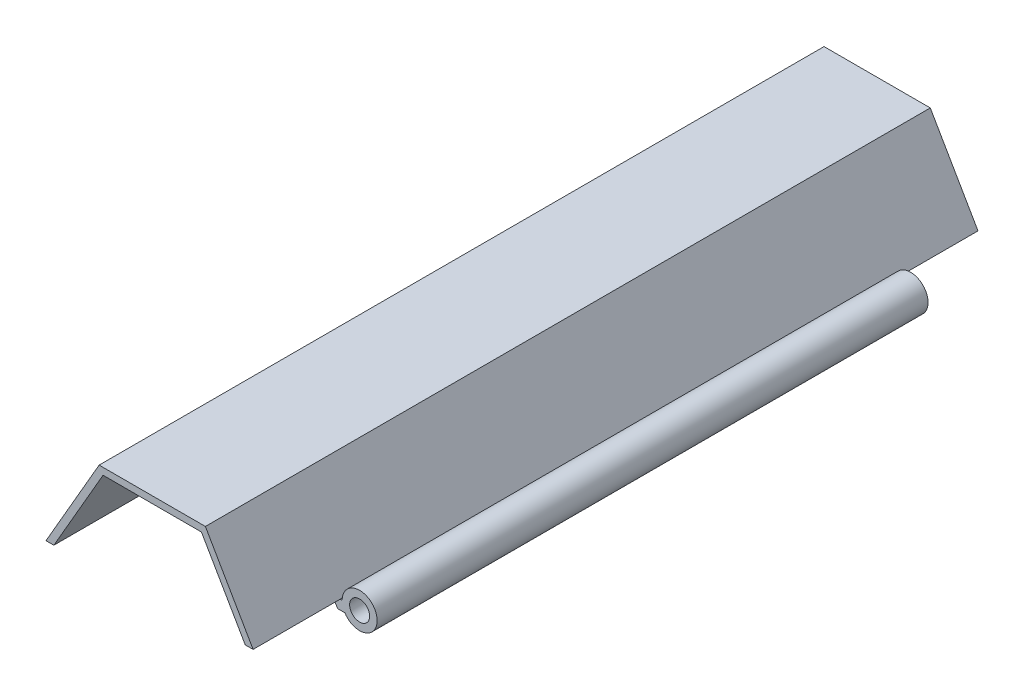
ISO-10303-21;
HEADER;
FILE_DESCRIPTION(('STEP AP214'),'2;1');
FILE_NAME('part.step','',(''),(''),'','','');
FILE_SCHEMA(('AUTOMOTIVE_DESIGN { 1 0 10303 214 1 1 1 1 }'));
ENDSEC;
DATA;
#1=APPLICATION_CONTEXT('core data for automotive mechanical design processes');
#2=APPLICATION_PROTOCOL_DEFINITION('international standard','automotive_design',2000,#1);
#3=PRODUCT_CONTEXT('',#1,'mechanical');
#4=PRODUCT('Part','Part','',(#3));
#5=PRODUCT_RELATED_PRODUCT_CATEGORY('part','',(#4));
#6=PRODUCT_DEFINITION_FORMATION('','',#4);
#7=PRODUCT_DEFINITION_CONTEXT('part definition',#1,'design');
#8=PRODUCT_DEFINITION('design','',#6,#7);
#9=PRODUCT_DEFINITION_SHAPE('','',#8);
#10=(LENGTH_UNIT() NAMED_UNIT(*) SI_UNIT(.MILLI.,.METRE.));
#11=(NAMED_UNIT(*) PLANE_ANGLE_UNIT() SI_UNIT($,.RADIAN.));
#12=(NAMED_UNIT(*) SI_UNIT($,.STERADIAN.) SOLID_ANGLE_UNIT());
#13=UNCERTAINTY_MEASURE_WITH_UNIT(LENGTH_MEASURE(1.E-05),#10,'distance_accuracy_value','');
#14=(GEOMETRIC_REPRESENTATION_CONTEXT(3) GLOBAL_UNCERTAINTY_ASSIGNED_CONTEXT((#13)) GLOBAL_UNIT_ASSIGNED_CONTEXT((#10,
#11,#12)) REPRESENTATION_CONTEXT('',''));
#15=CARTESIAN_POINT('',(0.,0.,0.));
#16=DIRECTION('',(0.,0.,1.));
#17=DIRECTION('',(1.,0.,0.));
#18=AXIS2_PLACEMENT_3D('',#15,#16,#17);
#19=CARTESIAN_POINT('',(0.,-1.95156391047385E-12,184.2));
#20=DIRECTION('',(0.,1.,0.));
#21=DIRECTION('',(-1.,0.,0.));
#22=AXIS2_PLACEMENT_3D('',#19,#20,#21);
#23=PLANE('',#22);
#24=DIRECTION('',(-1.,0.,0.));
#25=VECTOR('',#24,1.);
#26=CARTESIAN_POINT('',(25.,0.,22.098));
#27=LINE('',#26,#25);
#28=CARTESIAN_POINT('',(26.8417586531243,1.17961196366423E-13,22.098));
#29=VERTEX_POINT('',#28);
#30=CARTESIAN_POINT('',(25.,0.,22.098));
#31=VERTEX_POINT('',#30);
#32=EDGE_CURVE('E201',#29,#31,#27,.T.);
#33=ORIENTED_EDGE('',*,*,#32,.F.);
#34=DIRECTION('',(0.,0.,-1.));
#35=VECTOR('',#34,1.);
#36=CARTESIAN_POINT('',(26.8417586531243,1.43772388769611E-13,184.2));
#37=LINE('',#36,#35);
#38=CARTESIAN_POINT('',(26.8417586531243,1.55257751099924E-13,162.102));
#39=VERTEX_POINT('',#38);
#40=EDGE_CURVE('E48',#39,#29,#37,.T.);
#41=ORIENTED_EDGE('',*,*,#40,.F.);
#42=DIRECTION('',(1.,0.,0.));
#43=VECTOR('',#42,1.);
#44=CARTESIAN_POINT('',(25.,0.,162.102));
#45=LINE('',#44,#43);
#46=CARTESIAN_POINT('',(25.,0.,162.102));
#47=VERTEX_POINT('',#46);
#48=EDGE_CURVE('E198',#47,#39,#45,.T.);
#49=ORIENTED_EDGE('',*,*,#48,.F.);
#50=DIRECTION('',(0.,0.,-1.));
#51=VECTOR('',#50,1.);
#52=CARTESIAN_POINT('',(25.,0.,184.2));
#53=LINE('',#52,#51);
#54=EDGE_CURVE('E146',#47,#31,#53,.T.);
#55=ORIENTED_EDGE('',*,*,#54,.T.);
#56=EDGE_LOOP('',(#33,#41,#49,#55));
#57=FACE_BOUND('',#56,.T.);
#58=ADVANCED_FACE('F40',(#57),#23,.F.);
#59=CARTESIAN_POINT('',(30.5959063593286,2.38000000000014,184.2));
#60=DIRECTION('',(0.,0.,-1.));
#61=DIRECTION('',(-1.,0.,0.));
#62=AXIS2_PLACEMENT_3D('',#59,#60,#61);
#63=CYLINDRICAL_SURFACE('',#62,4.44500000000001);
#64=CARTESIAN_POINT('',(30.5959063593286,2.38000000000014,22.098));
#65=DIRECTION('',(0.,0.,-1.));
#66=DIRECTION('',(-1.,0.,0.));
#67=AXIS2_PLACEMENT_3D('',#64,#65,#66);
#68=CIRCLE('',#67,4.44499999999997);
#69=CARTESIAN_POINT('',(26.1509063593286,2.38000000000009,22.098));
#70=VERTEX_POINT('',#69);
#71=EDGE_CURVE('E187',#70,#29,#68,.T.);
#72=ORIENTED_EDGE('',*,*,#71,.F.);
#73=DIRECTION('',(0.,0.,-1.));
#74=VECTOR('',#73,1.);
#75=CARTESIAN_POINT('',(26.1509063593286,2.38000000000009,184.2));
#76=LINE('',#75,#74);
#77=CARTESIAN_POINT('',(26.1509063593287,2.38000000000016,162.102));
#78=VERTEX_POINT('',#77);
#79=EDGE_CURVE('E175',#78,#70,#76,.T.);
#80=ORIENTED_EDGE('',*,*,#79,.F.);
#81=CARTESIAN_POINT('',(30.5959063593286,2.38000000000014,162.102));
#82=DIRECTION('',(0.,0.,1.));
#83=DIRECTION('',(1.,0.,0.));
#84=AXIS2_PLACEMENT_3D('',#81,#82,#83);
#85=CIRCLE('',#84,4.44499999999991);
#86=EDGE_CURVE('E190',#39,#78,#85,.T.);
#87=ORIENTED_EDGE('',*,*,#86,.F.);
#88=ORIENTED_EDGE('',*,*,#40,.T.);
#89=EDGE_LOOP('',(#72,#80,#87,#88));
#90=FACE_BOUND('',#89,.T.);
#91=ADVANCED_FACE('F183',(#90),#63,.T.);
#92=CARTESIAN_POINT('',(2.92936970977087E-13,2.38000000000331,184.2));
#93=DIRECTION('',(1.23082760914571E-13,1.,0.));
#94=DIRECTION('',(-1.,1.23082760914571E-13,0.));
#95=AXIS2_PLACEMENT_3D('',#92,#93,#94);
#96=PLANE('',#95);
#97=ORIENTED_EDGE('',*,*,#79,.T.);
#98=DIRECTION('',(1.,0.,0.));
#99=VECTOR('',#98,1.);
#100=CARTESIAN_POINT('',(23.6259063593286,2.38000000000016,22.098));
#101=LINE('',#100,#99);
#102=CARTESIAN_POINT('',(25.6259063593288,2.3800000000001,22.098));
#103=VERTEX_POINT('',#102);
#104=EDGE_CURVE('E231',#103,#70,#101,.T.);
#105=ORIENTED_EDGE('',*,*,#104,.F.);
#106=DIRECTION('',(0.,0.,-1.));
#107=VECTOR('',#106,1.);
#108=CARTESIAN_POINT('',(25.6259063593287,2.38000000000016,184.2));
#109=LINE('',#108,#107);
#110=CARTESIAN_POINT('',(25.6259063593287,2.38000000000015,162.102));
#111=VERTEX_POINT('',#110);
#112=EDGE_CURVE('E173',#111,#103,#109,.T.);
#113=ORIENTED_EDGE('',*,*,#112,.F.);
#114=DIRECTION('',(-1.,0.,0.));
#115=VECTOR('',#114,1.);
#116=CARTESIAN_POINT('',(23.6259063593286,2.38000000000013,162.102));
#117=LINE('',#116,#115);
#118=EDGE_CURVE('E252',#78,#111,#117,.T.);
#119=ORIENTED_EDGE('',*,*,#118,.F.);
#120=EDGE_LOOP('',(#97,#105,#113,#119));
#121=FACE_BOUND('',#120,.T.);
#122=ADVANCED_FACE('F282',(#121),#96,.T.);
#123=CARTESIAN_POINT('',(30.5959063593286,2.38000000000014,184.2));
#124=DIRECTION('',(0.,0.,-1.));
#125=DIRECTION('',(-1.,0.,0.));
#126=AXIS2_PLACEMENT_3D('',#123,#124,#125);
#127=CYLINDRICAL_SURFACE('',#126,2.54);
#128=CARTESIAN_POINT('',(30.5959063593286,2.38000000000014,162.102));
#129=DIRECTION('',(0.,0.,1.));
#130=DIRECTION('',(1.,0.,0.));
#131=AXIS2_PLACEMENT_3D('',#128,#129,#130);
#132=CIRCLE('',#131,2.54);
#133=CARTESIAN_POINT('',(33.1359063593286,2.38000000000014,162.102));
#134=VERTEX_POINT('',#133);
#135=EDGE_CURVE('E150',#134,#134,#132,.T.);
#136=ORIENTED_EDGE('',*,*,#135,.T.);
#137=EDGE_LOOP('',(#136));
#138=FACE_BOUND('',#137,.T.);
#139=CARTESIAN_POINT('',(30.5959063593286,2.38000000000014,22.098));
#140=DIRECTION('',(0.,0.,-1.));
#141=DIRECTION('',(-1.,0.,0.));
#142=AXIS2_PLACEMENT_3D('',#139,#140,#141);
#143=CIRCLE('',#142,2.54);
#144=CARTESIAN_POINT('',(28.0559063593286,2.38000000000014,22.098));
#145=VERTEX_POINT('',#144);
#146=EDGE_CURVE('E240',#145,#145,#143,.T.);
#147=ORIENTED_EDGE('',*,*,#146,.T.);
#148=EDGE_LOOP('',(#147));
#149=FACE_BOUND('',#148,.T.);
#150=ADVANCED_FACE('F42',(#138,#149),#127,.F.);
#151=CARTESIAN_POINT('',(20.25,11.69134295109,184.2));
#152=DIRECTION('',(-0.866025403784436,-0.500000000000004,0.));
#153=DIRECTION('',(0.500000000000004,-0.866025403784436,0.));
#154=AXIS2_PLACEMENT_3D('',#151,#152,#153);
#155=PLANE('',#154);
#156=DIRECTION('',(-0.500000000000004,0.866025403784436,0.));
#157=VECTOR('',#156,1.);
#158=CARTESIAN_POINT('',(20.25,11.69134295109,0.));
#159=LINE('',#158,#157);
#160=CARTESIAN_POINT('',(25.6259063593288,2.3800000000001,0.));
#161=VERTEX_POINT('',#160);
#162=CARTESIAN_POINT('',(13.4999999999999,23.38268590218,0.));
#163=VERTEX_POINT('',#162);
#164=EDGE_CURVE('E147',#161,#163,#159,.T.);
#165=ORIENTED_EDGE('',*,*,#164,.T.);
#166=DIRECTION('',(0.,0.,-1.));
#167=VECTOR('',#166,1.);
#168=CARTESIAN_POINT('',(13.4999999999999,23.38268590218,184.2));
#169=LINE('',#168,#167);
#170=CARTESIAN_POINT('',(13.4999999999999,23.38268590218,184.2));
#171=VERTEX_POINT('',#170);
#172=EDGE_CURVE('E170',#171,#163,#169,.T.);
#173=ORIENTED_EDGE('',*,*,#172,.F.);
#174=DIRECTION('',(-0.500000000000004,0.866025403784436,0.));
#175=VECTOR('',#174,1.);
#176=CARTESIAN_POINT('',(20.25,11.69134295109,184.2));
#177=LINE('',#176,#175);
#178=CARTESIAN_POINT('',(25.6259063593287,2.38000000000016,184.2));
#179=VERTEX_POINT('',#178);
#180=EDGE_CURVE('E160',#179,#171,#177,.T.);
#181=ORIENTED_EDGE('',*,*,#180,.F.);
#182=EDGE_CURVE('E99',#179,#111,#109,.T.);
#183=ORIENTED_EDGE('',*,*,#182,.T.);
#184=ORIENTED_EDGE('',*,*,#112,.T.);
#185=DIRECTION('',(0.,0.,-1.));
#186=VECTOR('',#185,1.);
#187=CARTESIAN_POINT('',(25.6259063593288,2.3800000000001,184.2));
#188=LINE('',#187,#186);
#189=EDGE_CURVE('E218',#103,#161,#188,.T.);
#190=ORIENTED_EDGE('',*,*,#189,.T.);
#191=EDGE_LOOP('',(#165,#173,#181,#183,#184,#190));
#192=FACE_BOUND('',#191,.T.);
#193=ADVANCED_FACE('F277',(#192),#155,.F.);
#194=CARTESIAN_POINT('',(-1.08166651109076E-13,23.3826859021799,184.2));
#195=DIRECTION('',(0.,-1.,0.));
#196=DIRECTION('',(1.,0.,0.));
#197=AXIS2_PLACEMENT_3D('',#194,#195,#196);
#198=PLANE('',#197);
#199=DIRECTION('',(-1.,0.,0.));
#200=VECTOR('',#199,1.);
#201=CARTESIAN_POINT('',(-1.08166651109076E-13,23.3826859021799,0.));
#202=LINE('',#201,#200);
#203=CARTESIAN_POINT('',(-13.5000000000002,23.3826859021799,0.));
#204=VERTEX_POINT('',#203);
#205=EDGE_CURVE('E149',#163,#204,#202,.T.);
#206=ORIENTED_EDGE('',*,*,#205,.T.);
#207=DIRECTION('',(0.,0.,-1.));
#208=VECTOR('',#207,1.);
#209=CARTESIAN_POINT('',(-13.5000000000002,23.3826859021799,184.2));
#210=LINE('',#209,#208);
#211=CARTESIAN_POINT('',(-13.5000000000002,23.3826859021799,184.2));
#212=VERTEX_POINT('',#211);
#213=EDGE_CURVE('E167',#212,#204,#210,.T.);
#214=ORIENTED_EDGE('',*,*,#213,.F.);
#215=DIRECTION('',(-1.,0.,0.));
#216=VECTOR('',#215,1.);
#217=CARTESIAN_POINT('',(-1.08166651109076E-13,23.3826859021799,184.2));
#218=LINE('',#217,#216);
#219=EDGE_CURVE('E260',#171,#212,#218,.T.);
#220=ORIENTED_EDGE('',*,*,#219,.F.);
#221=ORIENTED_EDGE('',*,*,#172,.T.);
#222=EDGE_LOOP('',(#206,#214,#220,#221));
#223=FACE_BOUND('',#222,.T.);
#224=ADVANCED_FACE('F266',(#223),#198,.F.);
#225=CARTESIAN_POINT('',(-20.2500000000001,11.6913429510898,184.2));
#226=DIRECTION('',(0.866025403784442,-0.499999999999993,0.));
#227=DIRECTION('',(0.499999999999993,0.866025403784443,0.));
#228=AXIS2_PLACEMENT_3D('',#225,#226,#227);
#229=PLANE('',#228);
#230=DIRECTION('',(-0.499999999999993,-0.866025403784443,0.));
#231=VECTOR('',#230,1.);
#232=CARTESIAN_POINT('',(-20.2500000000001,11.6913429510898,0.));
#233=LINE('',#232,#231);
#234=CARTESIAN_POINT('',(-27.,-1.4997829630167E-13,0.));
#235=VERTEX_POINT('',#234);
#236=EDGE_CURVE('E152',#204,#235,#233,.T.);
#237=ORIENTED_EDGE('',*,*,#236,.T.);
#238=DIRECTION('',(0.,0.,-1.));
#239=VECTOR('',#238,1.);
#240=CARTESIAN_POINT('',(-27.,-1.4997829630167E-13,184.2));
#241=LINE('',#240,#239);
#242=CARTESIAN_POINT('',(-27.,-1.4997829630167E-13,184.2));
#243=VERTEX_POINT('',#242);
#244=EDGE_CURVE('E136',#243,#235,#241,.T.);
#245=ORIENTED_EDGE('',*,*,#244,.F.);
#246=DIRECTION('',(-0.499999999999993,-0.866025403784443,0.));
#247=VECTOR('',#246,1.);
#248=CARTESIAN_POINT('',(-20.2500000000001,11.6913429510898,184.2));
#249=LINE('',#248,#247);
#250=EDGE_CURVE('E123',#212,#243,#249,.T.);
#251=ORIENTED_EDGE('',*,*,#250,.F.);
#252=ORIENTED_EDGE('',*,*,#213,.T.);
#253=EDGE_LOOP('',(#237,#245,#251,#252));
#254=FACE_BOUND('',#253,.T.);
#255=ADVANCED_FACE('F270',(#254),#229,.F.);
#256=CARTESIAN_POINT('',(0.,-4.82021199948234E-13,184.2));
#257=DIRECTION('',(0.,1.,0.));
#258=DIRECTION('',(-1.,0.,0.));
#259=AXIS2_PLACEMENT_3D('',#256,#257,#258);
#260=PLANE('',#259);
#261=DIRECTION('',(1.,0.,0.));
#262=VECTOR('',#261,1.);
#263=CARTESIAN_POINT('',(0.,-4.82021199948234E-13,0.));
#264=LINE('',#263,#262);
#265=CARTESIAN_POINT('',(-25.,-1.74574066942157E-13,0.));
#266=VERTEX_POINT('',#265);
#267=EDGE_CURVE('E132',#235,#266,#264,.T.);
#268=ORIENTED_EDGE('',*,*,#267,.T.);
#269=DIRECTION('',(0.,0.,-1.));
#270=VECTOR('',#269,1.);
#271=CARTESIAN_POINT('',(-25.,-1.74574066942157E-13,184.2));
#272=LINE('',#271,#270);
#273=CARTESIAN_POINT('',(-25.,-1.74574066942157E-13,184.2));
#274=VERTEX_POINT('',#273);
#275=EDGE_CURVE('E129',#274,#266,#272,.T.);
#276=ORIENTED_EDGE('',*,*,#275,.F.);
#277=DIRECTION('',(1.,0.,0.));
#278=VECTOR('',#277,1.);
#279=CARTESIAN_POINT('',(0.,-4.82021199948234E-13,184.2));
#280=LINE('',#279,#278);
#281=EDGE_CURVE('E115',#243,#274,#280,.T.);
#282=ORIENTED_EDGE('',*,*,#281,.F.);
#283=ORIENTED_EDGE('',*,*,#244,.T.);
#284=EDGE_LOOP('',(#268,#276,#282,#283));
#285=FACE_BOUND('',#284,.T.);
#286=ADVANCED_FACE('F130',(#285),#260,.F.);
#287=CARTESIAN_POINT('',(-18.75,10.8253175473054,184.2));
#288=DIRECTION('',(0.866025403784442,-0.499999999999995,0.));
#289=DIRECTION('',(0.499999999999995,0.866025403784442,0.));
#290=AXIS2_PLACEMENT_3D('',#287,#288,#289);
#291=PLANE('',#290);
#292=DIRECTION('',(-0.499999999999995,-0.866025403784442,0.));
#293=VECTOR('',#292,1.);
#294=CARTESIAN_POINT('',(-18.75,10.8253175473054,0.));
#295=LINE('',#294,#293);
#296=CARTESIAN_POINT('',(-12.5000000000001,21.6506350946109,0.));
#297=VERTEX_POINT('',#296);
#298=EDGE_CURVE('E155',#297,#266,#295,.T.);
#299=ORIENTED_EDGE('',*,*,#298,.F.);
#300=DIRECTION('',(0.,0.,-1.));
#301=VECTOR('',#300,1.);
#302=CARTESIAN_POINT('',(-12.5000000000001,21.6506350946109,184.2));
#303=LINE('',#302,#301);
#304=CARTESIAN_POINT('',(-12.5000000000001,21.6506350946109,184.2));
#305=VERTEX_POINT('',#304);
#306=EDGE_CURVE('E137',#305,#297,#303,.T.);
#307=ORIENTED_EDGE('',*,*,#306,.F.);
#308=DIRECTION('',(-0.499999999999995,-0.866025403784442,0.));
#309=VECTOR('',#308,1.);
#310=CARTESIAN_POINT('',(-18.75,10.8253175473054,184.2));
#311=LINE('',#310,#309);
#312=EDGE_CURVE('E120',#305,#274,#311,.T.);
#313=ORIENTED_EDGE('',*,*,#312,.T.);
#314=ORIENTED_EDGE('',*,*,#275,.T.);
#315=EDGE_LOOP('',(#299,#307,#313,#314));
#316=FACE_BOUND('',#315,.T.);
#317=ADVANCED_FACE('F139',(#316),#291,.T.);
#318=CARTESIAN_POINT('',(0.,21.650635094611,184.2));
#319=DIRECTION('',(0.,-1.,0.));
#320=DIRECTION('',(1.,0.,0.));
#321=AXIS2_PLACEMENT_3D('',#318,#319,#320);
#322=PLANE('',#321);
#323=DIRECTION('',(-1.,0.,0.));
#324=VECTOR('',#323,1.);
#325=CARTESIAN_POINT('',(0.,21.650635094611,0.));
#326=LINE('',#325,#324);
#327=CARTESIAN_POINT('',(12.4999999999999,21.650635094611,0.));
#328=VERTEX_POINT('',#327);
#329=EDGE_CURVE('E157',#328,#297,#326,.T.);
#330=ORIENTED_EDGE('',*,*,#329,.F.);
#331=DIRECTION('',(0.,0.,-1.));
#332=VECTOR('',#331,1.);
#333=CARTESIAN_POINT('',(12.4999999999999,21.650635094611,184.2));
#334=LINE('',#333,#332);
#335=CARTESIAN_POINT('',(12.4999999999999,21.650635094611,184.2));
#336=VERTEX_POINT('',#335);
#337=EDGE_CURVE('E163',#336,#328,#334,.T.);
#338=ORIENTED_EDGE('',*,*,#337,.F.);
#339=DIRECTION('',(-1.,0.,0.));
#340=VECTOR('',#339,1.);
#341=CARTESIAN_POINT('',(0.,21.650635094611,184.2));
#342=LINE('',#341,#340);
#343=EDGE_CURVE('E140',#336,#305,#342,.T.);
#344=ORIENTED_EDGE('',*,*,#343,.T.);
#345=ORIENTED_EDGE('',*,*,#306,.T.);
#346=EDGE_LOOP('',(#330,#338,#344,#345));
#347=FACE_BOUND('',#346,.T.);
#348=ADVANCED_FACE('F275',(#347),#322,.T.);
#349=CARTESIAN_POINT('',(18.75,10.8253175473055,184.2));
#350=DIRECTION('',(-0.866025403784438,-0.500000000000001,0.));
#351=DIRECTION('',(0.500000000000001,-0.866025403784438,0.));
#352=AXIS2_PLACEMENT_3D('',#349,#350,#351);
#353=PLANE('',#352);
#354=DIRECTION('',(0.,0.,-1.));
#355=VECTOR('',#354,1.);
#356=CARTESIAN_POINT('',(23.6259063593286,2.38000000000016,22.098));
#357=LINE('',#356,#355);
#358=CARTESIAN_POINT('',(23.6259063593286,2.38000000000016,22.098));
#359=VERTEX_POINT('',#358);
#360=CARTESIAN_POINT('',(23.6259063593286,2.38000000000016,0.));
#361=VERTEX_POINT('',#360);
#362=EDGE_CURVE('E55',#359,#361,#357,.T.);
#363=ORIENTED_EDGE('',*,*,#362,.F.);
#364=DIRECTION('',(-0.500000000000001,0.866025403784438,0.));
#365=VECTOR('',#364,1.);
#366=CARTESIAN_POINT('',(23.6259063593286,2.38000000000016,22.098));
#367=LINE('',#366,#365);
#368=EDGE_CURVE('E234',#31,#359,#367,.T.);
#369=ORIENTED_EDGE('',*,*,#368,.F.);
#370=ORIENTED_EDGE('',*,*,#54,.F.);
#371=DIRECTION('',(0.500000000000001,-0.866025403784438,0.));
#372=VECTOR('',#371,1.);
#373=CARTESIAN_POINT('',(23.6259063593286,2.38000000000013,162.102));
#374=LINE('',#373,#372);
#375=CARTESIAN_POINT('',(23.6259063593286,2.38000000000013,162.102));
#376=VERTEX_POINT('',#375);
#377=EDGE_CURVE('E247',#376,#47,#374,.T.);
#378=ORIENTED_EDGE('',*,*,#377,.F.);
#379=DIRECTION('',(0.,0.,1.));
#380=VECTOR('',#379,1.);
#381=CARTESIAN_POINT('',(23.6259063593286,2.38000000000013,162.102));
#382=LINE('',#381,#380);
#383=CARTESIAN_POINT('',(23.6259063593286,2.38000000000013,184.2));
#384=VERTEX_POINT('',#383);
#385=EDGE_CURVE('E255',#376,#384,#382,.T.);
#386=ORIENTED_EDGE('',*,*,#385,.T.);
#387=DIRECTION('',(-0.500000000000001,0.866025403784438,0.));
#388=VECTOR('',#387,1.);
#389=CARTESIAN_POINT('',(18.75,10.8253175473055,184.2));
#390=LINE('',#389,#388);
#391=EDGE_CURVE('E64',#384,#336,#390,.T.);
#392=ORIENTED_EDGE('',*,*,#391,.T.);
#393=ORIENTED_EDGE('',*,*,#337,.T.);
#394=DIRECTION('',(-0.500000000000001,0.866025403784438,0.));
#395=VECTOR('',#394,1.);
#396=CARTESIAN_POINT('',(18.75,10.8253175473055,0.));
#397=LINE('',#396,#395);
#398=EDGE_CURVE('E92',#361,#328,#397,.T.);
#399=ORIENTED_EDGE('',*,*,#398,.F.);
#400=EDGE_LOOP('',(#363,#369,#370,#378,#386,#392,#393,#399));
#401=FACE_BOUND('',#400,.T.);
#402=ADVANCED_FACE('F238',(#401),#353,.T.);
#403=CARTESIAN_POINT('',(0.,0.,184.2));
#404=DIRECTION('',(0.,0.,1.));
#405=DIRECTION('',(1.,0.,0.));
#406=AXIS2_PLACEMENT_3D('',#403,#404,#405);
#407=PLANE('',#406);
#408=DIRECTION('',(-1.,0.,0.));
#409=VECTOR('',#408,1.);
#410=CARTESIAN_POINT('',(0.,2.37999999999986,184.2));
#411=LINE('',#410,#409);
#412=EDGE_CURVE('E11',#179,#384,#411,.T.);
#413=ORIENTED_EDGE('',*,*,#412,.F.);
#414=ORIENTED_EDGE('',*,*,#180,.T.);
#415=ORIENTED_EDGE('',*,*,#219,.T.);
#416=ORIENTED_EDGE('',*,*,#250,.T.);
#417=ORIENTED_EDGE('',*,*,#281,.T.);
#418=ORIENTED_EDGE('',*,*,#312,.F.);
#419=ORIENTED_EDGE('',*,*,#343,.F.);
#420=ORIENTED_EDGE('',*,*,#391,.F.);
#421=EDGE_LOOP('',(#413,#414,#415,#416,#417,#418,#419,#420));
#422=FACE_BOUND('',#421,.T.);
#423=ADVANCED_FACE('F117',(#422),#407,.T.);
#424=CARTESIAN_POINT('',(0.,0.,0.));
#425=DIRECTION('',(0.,0.,1.));
#426=DIRECTION('',(1.,0.,0.));
#427=AXIS2_PLACEMENT_3D('',#424,#425,#426);
#428=PLANE('',#427);
#429=ORIENTED_EDGE('',*,*,#164,.F.);
#430=DIRECTION('',(1.,0.,0.));
#431=VECTOR('',#430,1.);
#432=CARTESIAN_POINT('',(23.6259063593286,2.38000000000016,0.));
#433=LINE('',#432,#431);
#434=EDGE_CURVE('E236',#361,#161,#433,.T.);
#435=ORIENTED_EDGE('',*,*,#434,.F.);
#436=ORIENTED_EDGE('',*,*,#398,.T.);
#437=ORIENTED_EDGE('',*,*,#329,.T.);
#438=ORIENTED_EDGE('',*,*,#298,.T.);
#439=ORIENTED_EDGE('',*,*,#267,.F.);
#440=ORIENTED_EDGE('',*,*,#236,.F.);
#441=ORIENTED_EDGE('',*,*,#205,.F.);
#442=EDGE_LOOP('',(#429,#435,#436,#437,#438,#439,#440,#441));
#443=FACE_BOUND('',#442,.T.);
#444=ADVANCED_FACE('F272',(#443),#428,.F.);
#445=CARTESIAN_POINT('',(23.6259063593286,2.38000000000013,162.102));
#446=DIRECTION('',(0.,1.,0.));
#447=DIRECTION('',(-1.,0.,0.));
#448=AXIS2_PLACEMENT_3D('',#445,#446,#447);
#449=PLANE('',#448);
#450=ORIENTED_EDGE('',*,*,#412,.T.);
#451=ORIENTED_EDGE('',*,*,#385,.F.);
#452=EDGE_CURVE('E251',#111,#376,#117,.T.);
#453=ORIENTED_EDGE('',*,*,#452,.F.);
#454=ORIENTED_EDGE('',*,*,#182,.F.);
#455=EDGE_LOOP('',(#450,#451,#453,#454));
#456=FACE_BOUND('',#455,.T.);
#457=ADVANCED_FACE('F283',(#456),#449,.F.);
#458=CARTESIAN_POINT('',(30.5959063593286,2.38000000000014,162.102));
#459=DIRECTION('',(0.,0.,1.));
#460=DIRECTION('',(1.,0.,0.));
#461=AXIS2_PLACEMENT_3D('',#458,#459,#460);
#462=PLANE('',#461);
#463=ORIENTED_EDGE('',*,*,#135,.F.);
#464=EDGE_LOOP('',(#463));
#465=FACE_BOUND('',#464,.T.);
#466=ORIENTED_EDGE('',*,*,#377,.T.);
#467=ORIENTED_EDGE('',*,*,#48,.T.);
#468=ORIENTED_EDGE('',*,*,#86,.T.);
#469=ORIENTED_EDGE('',*,*,#118,.T.);
#470=ORIENTED_EDGE('',*,*,#452,.T.);
#471=EDGE_LOOP('',(#466,#467,#468,#469,#470));
#472=FACE_BOUND('',#471,.T.);
#473=ADVANCED_FACE('F285',(#465,#472),#462,.T.);
#474=CARTESIAN_POINT('',(23.6259063593286,2.38000000000016,22.098));
#475=DIRECTION('',(0.,1.,0.));
#476=DIRECTION('',(-1.,0.,0.));
#477=AXIS2_PLACEMENT_3D('',#474,#475,#476);
#478=PLANE('',#477);
#479=EDGE_CURVE('E226',#359,#103,#101,.T.);
#480=ORIENTED_EDGE('',*,*,#479,.F.);
#481=ORIENTED_EDGE('',*,*,#362,.T.);
#482=ORIENTED_EDGE('',*,*,#434,.T.);
#483=ORIENTED_EDGE('',*,*,#189,.F.);
#484=EDGE_LOOP('',(#480,#481,#482,#483));
#485=FACE_BOUND('',#484,.T.);
#486=ADVANCED_FACE('F228',(#485),#478,.F.);
#487=CARTESIAN_POINT('',(30.5959063593286,2.38000000000014,22.098));
#488=DIRECTION('',(0.,0.,-1.));
#489=DIRECTION('',(-1.,0.,0.));
#490=AXIS2_PLACEMENT_3D('',#487,#488,#489);
#491=PLANE('',#490);
#492=ORIENTED_EDGE('',*,*,#146,.F.);
#493=EDGE_LOOP('',(#492));
#494=FACE_BOUND('',#493,.T.);
#495=ORIENTED_EDGE('',*,*,#368,.T.);
#496=ORIENTED_EDGE('',*,*,#479,.T.);
#497=ORIENTED_EDGE('',*,*,#104,.T.);
#498=ORIENTED_EDGE('',*,*,#71,.T.);
#499=ORIENTED_EDGE('',*,*,#32,.T.);
#500=EDGE_LOOP('',(#495,#496,#497,#498,#499));
#501=FACE_BOUND('',#500,.T.);
#502=ADVANCED_FACE('F235',(#494,#501),#491,.T.);
#503=CLOSED_SHELL('',(#58,#91,#122,#150,#193,#224,#255,#286,#317,#348,#402,#423,#444,#457,#473,
#486,#502));
#504=MANIFOLD_SOLID_BREP('B2',#503);
#505=ADVANCED_BREP_SHAPE_REPRESENTATION('',(#18,#504),#14);
#506=SHAPE_DEFINITION_REPRESENTATION(#9,#505);
ENDSEC;
END-ISO-10303-21;
